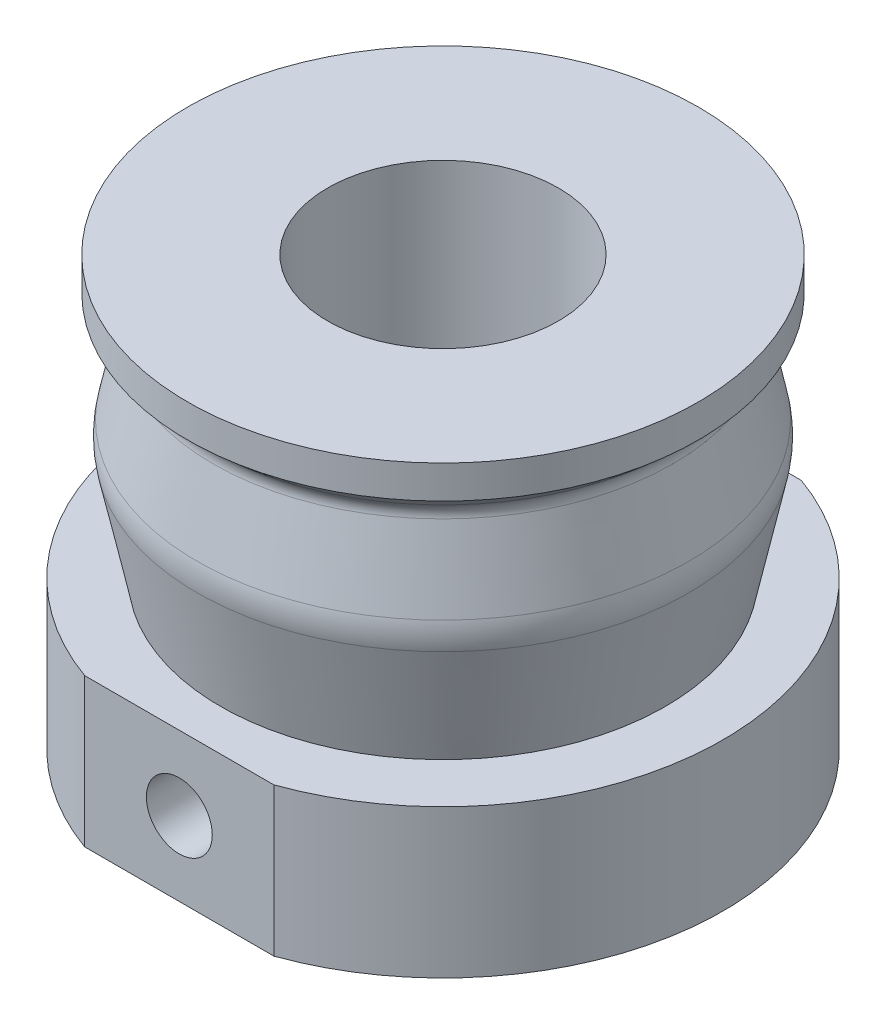
ISO-10303-21;
HEADER;
FILE_DESCRIPTION(('STEP AP214'),'2;1');
FILE_NAME('part.step','',(''),(''),'','','');
FILE_SCHEMA(('AUTOMOTIVE_DESIGN { 1 0 10303 214 1 1 1 1 }'));
ENDSEC;
DATA;
#1=APPLICATION_CONTEXT('core data for automotive mechanical design processes');
#2=APPLICATION_PROTOCOL_DEFINITION('international standard','automotive_design',2000,#1);
#3=PRODUCT_CONTEXT('',#1,'mechanical');
#4=PRODUCT('Part','Part','',(#3));
#5=PRODUCT_RELATED_PRODUCT_CATEGORY('part','',(#4));
#6=PRODUCT_DEFINITION_FORMATION('','',#4);
#7=PRODUCT_DEFINITION_CONTEXT('part definition',#1,'design');
#8=PRODUCT_DEFINITION('design','',#6,#7);
#9=PRODUCT_DEFINITION_SHAPE('','',#8);
#10=(LENGTH_UNIT() NAMED_UNIT(*) SI_UNIT(.MILLI.,.METRE.));
#11=(NAMED_UNIT(*) PLANE_ANGLE_UNIT() SI_UNIT($,.RADIAN.));
#12=(NAMED_UNIT(*) SI_UNIT($,.STERADIAN.) SOLID_ANGLE_UNIT());
#13=UNCERTAINTY_MEASURE_WITH_UNIT(LENGTH_MEASURE(1.E-05),#10,'distance_accuracy_value','');
#14=(GEOMETRIC_REPRESENTATION_CONTEXT(3) GLOBAL_UNCERTAINTY_ASSIGNED_CONTEXT((#13)) GLOBAL_UNIT_ASSIGNED_CONTEXT((#10,
#11,#12)) REPRESENTATION_CONTEXT('',''));
#15=CARTESIAN_POINT('',(0.,0.,0.));
#16=DIRECTION('',(0.,0.,1.));
#17=DIRECTION('',(1.,0.,0.));
#18=AXIS2_PLACEMENT_3D('',#15,#16,#17);
#19=CARTESIAN_POINT('',(8.5,0.,0.));
#20=DIRECTION('',(0.,-1.,0.));
#21=DIRECTION('',(0.,0.,-1.));
#22=AXIS2_PLACEMENT_3D('',#19,#20,#21);
#23=PLANE('',#22);
#24=CARTESIAN_POINT('',(0.,0.,0.));
#25=DIRECTION('',(0.,-1.,0.));
#26=DIRECTION('',(0.,0.,-1.));
#27=AXIS2_PLACEMENT_3D('',#24,#25,#26);
#28=CIRCLE('',#27,3.5);
#29=CARTESIAN_POINT('',(0.,0.,-3.5));
#30=VERTEX_POINT('',#29);
#31=EDGE_CURVE('E116',#30,#30,#28,.T.);
#32=ORIENTED_EDGE('',*,*,#31,.F.);
#33=EDGE_LOOP('',(#32));
#34=FACE_BOUND('',#33,.T.);
#35=CARTESIAN_POINT('',(0.,0.,0.));
#36=DIRECTION('',(0.,-1.,0.));
#37=DIRECTION('',(0.,0.,-1.));
#38=AXIS2_PLACEMENT_3D('',#35,#36,#37);
#39=CIRCLE('',#38,8.5);
#40=CARTESIAN_POINT('',(-2.87228132326902,0.,8.));
#41=VERTEX_POINT('',#40);
#42=CARTESIAN_POINT('',(-2.87228132326902,0.,-8.));
#43=VERTEX_POINT('',#42);
#44=EDGE_CURVE('E98',#41,#43,#39,.T.);
#45=ORIENTED_EDGE('',*,*,#44,.T.);
#46=DIRECTION('',(1.,0.,0.));
#47=VECTOR('',#46,1.);
#48=CARTESIAN_POINT('',(-2.87228132326902,0.,-8.));
#49=LINE('',#48,#47);
#50=CARTESIAN_POINT('',(2.87228132326902,0.,-8.));
#51=VERTEX_POINT('',#50);
#52=EDGE_CURVE('E48',#43,#51,#49,.T.);
#53=ORIENTED_EDGE('',*,*,#52,.T.);
#54=CARTESIAN_POINT('',(2.87228132326902,0.,8.));
#55=VERTEX_POINT('',#54);
#56=EDGE_CURVE('E308',#51,#55,#39,.T.);
#57=ORIENTED_EDGE('',*,*,#56,.T.);
#58=DIRECTION('',(1.,0.,0.));
#59=VECTOR('',#58,1.);
#60=CARTESIAN_POINT('',(-2.87228132326902,0.,8.));
#61=LINE('',#60,#59);
#62=EDGE_CURVE('E314',#41,#55,#61,.T.);
#63=ORIENTED_EDGE('',*,*,#62,.F.);
#64=EDGE_LOOP('',(#45,#53,#57,#63));
#65=FACE_BOUND('',#64,.T.);
#66=ADVANCED_FACE('F33',(#34,#65),#23,.T.);
#67=CARTESIAN_POINT('',(6.75,4.5,0.));
#68=DIRECTION('',(0.,1.,0.));
#69=DIRECTION('',(0.,0.,1.));
#70=AXIS2_PLACEMENT_3D('',#67,#68,#69);
#71=PLANE('',#70);
#72=CARTESIAN_POINT('',(0.,4.5,0.));
#73=DIRECTION('',(0.,-1.,0.));
#74=DIRECTION('',(0.,0.,-1.));
#75=AXIS2_PLACEMENT_3D('',#72,#73,#74);
#76=CIRCLE('',#75,6.75);
#77=CARTESIAN_POINT('',(0.,4.5,-6.75));
#78=VERTEX_POINT('',#77);
#79=EDGE_CURVE('E93',#78,#78,#76,.T.);
#80=ORIENTED_EDGE('',*,*,#79,.T.);
#81=EDGE_LOOP('',(#80));
#82=FACE_BOUND('',#81,.T.);
#83=CARTESIAN_POINT('',(0.,4.5,0.));
#84=DIRECTION('',(0.,-1.,0.));
#85=DIRECTION('',(0.,0.,-1.));
#86=AXIS2_PLACEMENT_3D('',#83,#84,#85);
#87=CIRCLE('',#86,8.5);
#88=CARTESIAN_POINT('',(2.87228132326902,4.5,-8.));
#89=VERTEX_POINT('',#88);
#90=CARTESIAN_POINT('',(2.87228132326902,4.5,8.));
#91=VERTEX_POINT('',#90);
#92=EDGE_CURVE('E88',#89,#91,#87,.T.);
#93=ORIENTED_EDGE('',*,*,#92,.F.);
#94=DIRECTION('',(1.,0.,0.));
#95=VECTOR('',#94,1.);
#96=CARTESIAN_POINT('',(-2.87228132326902,4.5,-8.));
#97=LINE('',#96,#95);
#98=CARTESIAN_POINT('',(-2.87228132326902,4.5,-8.));
#99=VERTEX_POINT('',#98);
#100=EDGE_CURVE('E75',#99,#89,#97,.T.);
#101=ORIENTED_EDGE('',*,*,#100,.F.);
#102=CARTESIAN_POINT('',(-2.87228132326902,4.5,7.99999999999999));
#103=VERTEX_POINT('',#102);
#104=EDGE_CURVE('E87',#103,#99,#87,.T.);
#105=ORIENTED_EDGE('',*,*,#104,.F.);
#106=DIRECTION('',(1.,0.,0.));
#107=VECTOR('',#106,1.);
#108=CARTESIAN_POINT('',(-2.87228132326902,4.5,8.));
#109=LINE('',#108,#107);
#110=EDGE_CURVE('E56',#103,#91,#109,.T.);
#111=ORIENTED_EDGE('',*,*,#110,.T.);
#112=EDGE_LOOP('',(#93,#101,#105,#111));
#113=FACE_BOUND('',#112,.T.);
#114=ADVANCED_FACE('F86',(#82,#113),#71,.T.);
#115=CARTESIAN_POINT('',(0.,0.,0.));
#116=DIRECTION('',(0.,-1.,0.));
#117=DIRECTION('',(0.,0.,-1.));
#118=AXIS2_PLACEMENT_3D('',#115,#116,#117);
#119=CYLINDRICAL_SURFACE('',#118,8.5);
#120=ORIENTED_EDGE('',*,*,#56,.F.);
#121=DIRECTION('',(0.,-1.,0.));
#122=VECTOR('',#121,1.);
#123=CARTESIAN_POINT('',(2.87228132326902,10.2662812973354,-8.));
#124=LINE('',#123,#122);
#125=EDGE_CURVE('E81',#89,#51,#124,.T.);
#126=ORIENTED_EDGE('',*,*,#125,.F.);
#127=ORIENTED_EDGE('',*,*,#92,.T.);
#128=DIRECTION('',(0.,-1.,0.));
#129=VECTOR('',#128,1.);
#130=CARTESIAN_POINT('',(2.87228132326902,10.2662812973354,8.));
#131=LINE('',#130,#129);
#132=EDGE_CURVE('E309',#91,#55,#131,.T.);
#133=ORIENTED_EDGE('',*,*,#132,.T.);
#134=EDGE_LOOP('',(#120,#126,#127,#133));
#135=FACE_BOUND('',#134,.T.);
#136=ADVANCED_FACE('F139',(#135),#119,.T.);
#137=ORIENTED_EDGE('',*,*,#104,.T.);
#138=DIRECTION('',(0.,-1.,0.));
#139=VECTOR('',#138,1.);
#140=CARTESIAN_POINT('',(-2.87228132326902,10.2662812973354,-8.));
#141=LINE('',#140,#139);
#142=EDGE_CURVE('E72',#99,#43,#141,.T.);
#143=ORIENTED_EDGE('',*,*,#142,.T.);
#144=ORIENTED_EDGE('',*,*,#44,.F.);
#145=DIRECTION('',(0.,-1.,0.));
#146=VECTOR('',#145,1.);
#147=CARTESIAN_POINT('',(-2.87228132326902,10.2662812973354,8.));
#148=LINE('',#147,#146);
#149=EDGE_CURVE('E92',#103,#41,#148,.T.);
#150=ORIENTED_EDGE('',*,*,#149,.F.);
#151=EDGE_LOOP('',(#137,#143,#144,#150));
#152=FACE_BOUND('',#151,.T.);
#153=ADVANCED_FACE('F91',(#152),#119,.T.);
#154=CARTESIAN_POINT('',(0.,0.,0.));
#155=DIRECTION('',(0.,-1.,0.));
#156=DIRECTION('',(0.,0.,-1.));
#157=AXIS2_PLACEMENT_3D('',#154,#155,#156);
#158=CYLINDRICAL_SURFACE('',#157,3.5);
#159=CARTESIAN_POINT('',(0.,3.25,-3.5));
#160=CARTESIAN_POINT('',(-0.0549774511886256,3.24999903021902,-3.49999934647171));
#161=CARTESIAN_POINT('',(-0.109964873936291,3.24545110551194,-3.49869208701023));
#162=CARTESIAN_POINT('',(-0.218345995598494,3.22741786494884,-3.4936045297255));
#163=CARTESIAN_POINT('',(-0.271739083414807,3.21392916696296,-3.48982329605034));
#164=CARTESIAN_POINT('',(-0.375352150368935,3.17849598079174,-3.48020345674544));
#165=CARTESIAN_POINT('',(-0.425576440424113,3.15656328192402,-3.474367720532));
#166=CARTESIAN_POINT('',(-0.521634380564634,3.10491100426083,-3.46124989158242));
#167=CARTESIAN_POINT('',(-0.567467570589076,3.07519061075486,-3.45396764753901));
#168=CARTESIAN_POINT('',(-0.654647223429477,3.0079824946635,-3.43852367312903));
#169=CARTESIAN_POINT('',(-0.695861861190489,2.97032762307222,-3.4303452097302));
#170=CARTESIAN_POINT('',(-0.771485678962154,2.88867612843131,-3.41413367457396));
#171=CARTESIAN_POINT('',(-0.805893838538837,2.84467855618443,-3.40610062478085));
#172=CARTESIAN_POINT('',(-0.867598950032227,2.75050320860399,-3.39091507439313));
#173=CARTESIAN_POINT('',(-0.894739105517027,2.70021900746547,-3.38378351259108));
#174=CARTESIAN_POINT('',(-0.940125852769614,2.59556399412672,-3.37145671914235));
#175=CARTESIAN_POINT('',(-0.958374357777523,2.5411940639724,-3.36626107099664));
#176=CARTESIAN_POINT('',(-0.984992165068875,2.43138261841595,-3.35856804120241));
#177=CARTESIAN_POINT('',(-0.993602766016074,2.37600431860089,-3.35600489366891));
#178=CARTESIAN_POINT('',(-1.00145333894795,2.26453442575838,-3.35367104182518));
#179=CARTESIAN_POINT('',(-1.00069534704803,2.20844299036685,-3.35389973075333));
#180=CARTESIAN_POINT('',(-0.990020673813952,2.0990656942732,-3.35706517184156));
#181=CARTESIAN_POINT('',(-0.980401628641804,2.04574782440997,-3.35991391343389));
#182=CARTESIAN_POINT('',(-0.952756930429097,1.94151639018586,-3.36785674196985));
#183=CARTESIAN_POINT('',(-0.934730517406289,1.89060304363966,-3.37295103189706));
#184=CARTESIAN_POINT('',(-0.890553405689019,1.79187687778419,-3.38488431756517));
#185=CARTESIAN_POINT('',(-0.864302755864396,1.74411146379919,-3.39174458202416));
#186=CARTESIAN_POINT('',(-0.804491895839435,1.65356171939327,-3.40642608441438));
#187=CARTESIAN_POINT('',(-0.770930058366727,1.61077850113254,-3.41424753611068));
#188=CARTESIAN_POINT('',(-0.695951998365102,1.52971381219683,-3.43033125328062));
#189=CARTESIAN_POINT('',(-0.654287437422664,1.49166276201639,-3.43859902286152));
#190=CARTESIAN_POINT('',(-0.565066141193114,1.42303699817986,-3.45438123609203));
#191=CARTESIAN_POINT('',(-0.517509100740947,1.39246267197915,-3.46189564068921));
#192=CARTESIAN_POINT('',(-0.417461536545723,1.33953563261298,-3.47538264032742));
#193=CARTESIAN_POINT('',(-0.364944908905003,1.31722985659791,-3.48134637748612));
#194=CARTESIAN_POINT('',(-0.256696614983736,1.28183305429159,-3.49099625743795));
#195=CARTESIAN_POINT('',(-0.200965762905074,1.26873970537736,-3.49468297428128));
#196=CARTESIAN_POINT('',(-0.0898331943221761,1.25251335714527,-3.49927437257336));
#197=CARTESIAN_POINT('',(-0.0344806734302551,1.24906765231349,-3.50026636425301));
#198=CARTESIAN_POINT('',(0.0760132634027893,1.25136363315052,-3.49961042353544));
#199=CARTESIAN_POINT('',(0.131154703878551,1.25710421642296,-3.49796280790309));
#200=CARTESIAN_POINT('',(0.238509316715157,1.27735522215813,-3.49226963342609));
#201=CARTESIAN_POINT('',(0.290759105867425,1.29168659066171,-3.48827306508862));
#202=CARTESIAN_POINT('',(0.392104343102813,1.32850025099232,-3.4783399937092));
#203=CARTESIAN_POINT('',(0.441199425624335,1.35098348544461,-3.47240326632854));
#204=CARTESIAN_POINT('',(0.536020842560035,1.40401166832262,-3.45904980584657));
#205=CARTESIAN_POINT('',(0.581651243270125,1.43472059941289,-3.45160381589488));
#206=CARTESIAN_POINT('',(0.667219264029652,1.50312625297532,-3.43608973548903));
#207=CARTESIAN_POINT('',(0.707155585421212,1.54082456503143,-3.42802150376367));
#208=CARTESIAN_POINT('',(0.781553214170351,1.6236046710256,-3.41184309815947));
#209=CARTESIAN_POINT('',(0.815792713704768,1.66888763778285,-3.40374018433795));
#210=CARTESIAN_POINT('',(0.876197658032578,1.76473129430901,-3.38869447362751));
#211=CARTESIAN_POINT('',(0.902363383738852,1.81529180037321,-3.3817516363796));
#212=CARTESIAN_POINT('',(0.945687270594169,1.92004560549588,-3.36989325638715));
#213=CARTESIAN_POINT('',(0.962893166212214,1.97421788178634,-3.36496700079018));
#214=CARTESIAN_POINT('',(0.987897250353702,2.08485496782719,-3.35771228398834));
#215=CARTESIAN_POINT('',(0.995698289511609,2.141319077551,-3.35538303564047));
#216=CARTESIAN_POINT('',(1.00149012123096,2.25264801646077,-3.35365851547575));
#217=CARTESIAN_POINT('',(0.99984013822114,2.30749275227629,-3.35415580399703));
#218=CARTESIAN_POINT('',(0.987623554788213,2.41608736533289,-3.35777298607399));
#219=CARTESIAN_POINT('',(0.9770572518996,2.4698372790465,-3.36089279211717));
#220=CARTESIAN_POINT('',(0.947529844083141,2.57418918558376,-3.36933488579116));
#221=CARTESIAN_POINT('',(0.928655458931762,2.62481769350544,-3.37463438524179));
#222=CARTESIAN_POINT('',(0.883114746507967,2.72222936724624,-3.38683651421364));
#223=CARTESIAN_POINT('',(0.856447040215776,2.76901185063665,-3.3937394274128));
#224=CARTESIAN_POINT('',(0.795032732674123,2.85909176090262,-3.40865834474881));
#225=CARTESIAN_POINT('',(0.760046138613654,2.90222069567097,-3.41670381589509));
#226=CARTESIAN_POINT('',(0.683429920189677,2.98211194790492,-3.43284922546139));
#227=CARTESIAN_POINT('',(0.641798625364279,3.0188726595554,-3.4409491770859));
#228=CARTESIAN_POINT('',(0.551787160432694,3.08591859216331,-3.45653979786176));
#229=CARTESIAN_POINT('',(0.503261251179889,3.11601349363481,-3.46400950518705));
#230=CARTESIAN_POINT('',(0.40162526482333,3.167572892511,-3.47725697888987));
#231=CARTESIAN_POINT('',(0.348517712057369,3.18904210596653,-3.48303566935144));
#232=CARTESIAN_POINT('',(0.246458157667516,3.22042377569772,-3.49163672362654));
#233=CARTESIAN_POINT('',(0.197881503812194,3.23148676834228,-3.49474842181038));
#234=CARTESIAN_POINT('',(0.0995391843931832,3.24627482862107,-3.49893021926074));
#235=CARTESIAN_POINT('',(0.0497736788080457,3.25000087798844,-3.50000059166998));
#236=CARTESIAN_POINT('',(0.,3.25,-3.5));
#237=B_SPLINE_CURVE_WITH_KNOTS('',3,(#159,#160,#161,#162,#163,#164,#165,#166,#167,#168,#169,
#170,#171,#172,#173,#174,#175,#176,#177,#178,#179,#180,#181,#182,#183,#184,#185,#186,#187,#188,
#189,#190,#191,#192,#193,#194,#195,#196,#197,#198,#199,#200,#201,#202,#203,#204,#205,#206,#207,
#208,#209,#210,#211,#212,#213,#214,#215,#216,#217,#218,#219,#220,#221,#222,#223,#224,#225,#226,
#227,#228,#229,#230,#231,#232,#233,#234,#235,#236),.UNSPECIFIED.,.T.,.F.,(4,2,2,2,2,2,2,2,2,2,2,
2,2,2,2,2,2,2,2,2,2,2,2,2,2,2,2,2,2,2,2,2,2,2,2,2,2,2,4),(0.,0.164749656271172,
0.329561669897589,0.494144406447671,0.658744367717578,0.827239057653905,0.995758989368565,
1.16766537650028,1.33953475772405,1.50699754929408,1.67442394611627,1.83642392910677,
1.99843855889074,2.16250401641616,2.32660602784682,2.49689250297262,2.66718780073735,
2.83843550548235,3.00964002003317,3.17522728845111,3.34079468713335,3.5030257023577,
3.66527548283775,3.83103762668236,3.99683751589904,4.16806052438178,4.3392775747866,
4.50957286677748,4.6798165288708,4.84363340801449,5.00744482086202,5.16958548138844,
5.33175484992001,5.49933828438394,5.66696391547448,5.83888989478294,6.01072174610256,
6.15989734012185,6.30905297207071),.UNSPECIFIED.);
#238=CARTESIAN_POINT('',(0.,3.25,-3.5));
#239=VERTEX_POINT('',#238);
#240=EDGE_CURVE('E161',#239,#239,#237,.T.);
#241=ORIENTED_EDGE('',*,*,#240,.F.);
#242=EDGE_LOOP('',(#241));
#243=FACE_BOUND('',#242,.T.);
#244=CARTESIAN_POINT('',(0.999999999999998,2.25,3.35410196624969));
#245=CARTESIAN_POINT('',(0.999999010234616,2.19507423107725,3.3541027352982));
#246=CARTESIAN_POINT('',(0.995459333009391,2.14013845792023,3.35546589937234));
#247=CARTESIAN_POINT('',(0.977461816962146,2.03186438061244,3.36075194701915));
#248=CARTESIAN_POINT('',(0.964000350683297,1.97852673545843,3.36467587174621));
#249=CARTESIAN_POINT('',(0.928646716460407,1.8750313995488,3.37460354734502));
#250=CARTESIAN_POINT('',(0.906767603258317,1.82486892408729,3.38060407621639));
#251=CARTESIAN_POINT('',(0.855241820315738,1.72891609422696,3.3940046055512));
#252=CARTESIAN_POINT('',(0.825594228332017,1.68312625981211,3.40140477214508));
#253=CARTESIAN_POINT('',(0.7584624004907,1.59590421734143,3.41700891605117));
#254=CARTESIAN_POINT('',(0.720794605566167,1.55461609893508,3.42522877981549));
#255=CARTESIAN_POINT('',(0.639085622734712,1.47884860834841,3.44140982756535));
#256=CARTESIAN_POINT('',(0.595043689579836,1.44437003343866,3.44937098116968));
#257=CARTESIAN_POINT('',(0.500823016078772,1.38258567582316,3.46431666000612));
#258=CARTESIAN_POINT('',(0.450545391880927,1.35542519012449,3.47128027250395));
#259=CARTESIAN_POINT('',(0.345904237619825,1.30999911279204,3.48326270242804));
#260=CARTESIAN_POINT('',(0.291541505437587,1.29173178937987,3.48828189845443));
#261=CARTESIAN_POINT('',(0.181779287560587,1.26508276938014,3.49569759650108));
#262=CARTESIAN_POINT('',(0.126443899064519,1.25645548914766,3.49815913505649));
#263=CARTESIAN_POINT('',(0.0150600512109618,1.24855663305838,3.50041047829849));
#264=CARTESIAN_POINT('',(-0.0409882697942744,1.24928326883132,3.50020079369491));
#265=CARTESIAN_POINT('',(-0.150490097867611,1.25990318745901,3.49718003381653));
#266=CARTESIAN_POINT('',(-0.203971773054473,1.26953080631899,3.49444435388027));
#267=CARTESIAN_POINT('',(-0.308526111088809,1.29724755123219,3.48676943165067));
#268=CARTESIAN_POINT('',(-0.359598627150254,1.31533719213106,3.48183005528105));
#269=CARTESIAN_POINT('',(-0.458536916864462,1.35965470040591,3.47019515886062));
#270=CARTESIAN_POINT('',(-0.506361521925386,1.38596938890417,3.46348102756093));
#271=CARTESIAN_POINT('',(-0.597003621795241,1.44592229319901,3.44901384486994));
#272=CARTESIAN_POINT('',(-0.639820016208003,1.47956211383323,3.44126056595877));
#273=CARTESIAN_POINT('',(-0.720816324273876,1.5546028553093,3.42522841509913));
#274=CARTESIAN_POINT('',(-0.758780788792452,1.59623471680255,3.41694064685079));
#275=CARTESIAN_POINT('',(-0.827246507874876,1.68535754592295,3.4010148689311));
#276=CARTESIAN_POINT('',(-0.857747156891286,1.73284898847439,3.39337691201241));
#277=CARTESIAN_POINT('',(-0.910616679927254,1.83286544224911,3.37957587408658));
#278=CARTESIAN_POINT('',(-0.932918688943924,1.88542761252626,3.37342505474766));
#279=CARTESIAN_POINT('',(-0.96829475748038,1.99377658175188,3.36344272188227));
#280=CARTESIAN_POINT('',(-0.981371502013289,2.04956243732834,3.35961053356453));
#281=CARTESIAN_POINT('',(-0.997537085998826,2.16074021216189,3.35484557617748));
#282=CARTESIAN_POINT('',(-1.00095074078696,2.21608090846044,3.35381855730448));
#283=CARTESIAN_POINT('',(-0.998594983598454,2.32654415795746,3.35452079870229));
#284=CARTESIAN_POINT('',(-0.992826717122484,2.38166673750731,3.35624971515342));
#285=CARTESIAN_POINT('',(-0.972558907129288,2.48882061401528,3.36217715008271));
#286=CARTESIAN_POINT('',(-0.958262310920607,2.5408937930086,3.3663182147774));
#287=CARTESIAN_POINT('',(-0.92157580933224,2.64190093599785,3.37654531970352));
#288=CARTESIAN_POINT('',(-0.899184736133866,2.69083444582255,3.38263164056921));
#289=CARTESIAN_POINT('',(-0.846309825608091,2.78551103760866,3.3962509400331));
#290=CARTESIAN_POINT('',(-0.815639458645649,2.83114522210117,3.4038159869019));
#291=CARTESIAN_POINT('',(-0.747302318424214,2.9167381867216,3.41946863275287));
#292=CARTESIAN_POINT('',(-0.709634028840686,2.95669573350605,3.42755634473907));
#293=CARTESIAN_POINT('',(-0.626854004982777,3.03118970914411,3.44367363717939));
#294=CARTESIAN_POINT('',(-0.581533855120274,3.06549748570937,3.45169203023043));
#295=CARTESIAN_POINT('',(-0.485592653528773,3.12602284069136,3.46648988523027));
#296=CARTESIAN_POINT('',(-0.434971879049092,3.15224084196119,3.47326941192714));
#297=CARTESIAN_POINT('',(-0.330216636478083,3.19559214351316,3.48478252423195));
#298=CARTESIAN_POINT('',(-0.276112399949818,3.21279419479308,3.48953154063622));
#299=CARTESIAN_POINT('',(-0.165622824274962,3.23781340097009,3.49651669811944));
#300=CARTESIAN_POINT('',(-0.109238075792719,3.24563297009066,3.4987534856151));
#301=CARTESIAN_POINT('',(0.00208911897951403,3.25149571699889,3.50042667501642));
#302=CARTESIAN_POINT('',(0.0570128155249777,3.24987207454141,3.49995851794498));
#303=CARTESIAN_POINT('',(0.165772586211001,3.23768085929485,3.49649534561067));
#304=CARTESIAN_POINT('',(0.219608712308764,3.22711371480898,3.49350045135296));
#305=CARTESIAN_POINT('',(0.324202066519792,3.19753431951057,3.48534400930059));
#306=CARTESIAN_POINT('',(0.374982516717523,3.17859841052801,3.4802020702409));
#307=CARTESIAN_POINT('',(0.472673601380729,3.13288692085726,3.46828547071724));
#308=CARTESIAN_POINT('',(0.519583635290338,3.10611012645387,3.46151055750883));
#309=CARTESIAN_POINT('',(0.609716728176954,3.04455133128759,3.44679477720104));
#310=CARTESIAN_POINT('',(0.652788664003537,3.00955495660581,3.43882522893152));
#311=CARTESIAN_POINT('',(0.732560611159187,2.93294543727302,3.42272032493228));
#312=CARTESIAN_POINT('',(0.769258856094886,2.89133046445754,3.4145849239342));
#313=CARTESIAN_POINT('',(0.836204230145641,2.80135154150232,3.39882018772077));
#314=CARTESIAN_POINT('',(0.866256583618023,2.75283902624844,3.39120975884781));
#315=CARTESIAN_POINT('',(0.917739718098037,2.65123906734251,3.37764222665284));
#316=CARTESIAN_POINT('',(0.939175324424087,2.59815420445517,3.37168419857914));
#317=CARTESIAN_POINT('',(0.970492670062519,2.49617314988425,3.36279229780034));
#318=CARTESIAN_POINT('',(0.981529499909263,2.44765482595075,3.3595621942308));
#319=CARTESIAN_POINT('',(0.996283035217827,2.34942694082203,3.35521684727178));
#320=CARTESIAN_POINT('',(1.00000089591333,2.29971756887699,3.35410127012429));
#321=CARTESIAN_POINT('',(0.999999999999998,2.25,3.35410196624969));
#322=B_SPLINE_CURVE_WITH_KNOTS('',3,(#244,#245,#246,#247,#248,#249,#250,#251,#252,#253,#254,
#255,#256,#257,#258,#259,#260,#261,#262,#263,#264,#265,#266,#267,#268,#269,#270,#271,#272,#273,
#274,#275,#276,#277,#278,#279,#280,#281,#282,#283,#284,#285,#286,#287,#288,#289,#290,#291,#292,
#293,#294,#295,#296,#297,#298,#299,#300,#301,#302,#303,#304,#305,#306,#307,#308,#309,#310,#311,
#312,#313,#314,#315,#316,#317,#318,#319,#320,#321),.UNSPECIFIED.,.T.,.F.,(4,2,2,2,2,2,2,2,2,2,2,
2,2,2,2,2,2,2,2,2,2,2,2,2,2,2,2,2,2,2,2,2,2,2,2,2,2,2,4),(0.,0.164594171159104,0.32925530476515,
0.493662091823937,0.658088405459392,0.826785835988799,0.995503006148132,1.16735741502495,
1.33917834504425,1.50651450509943,1.67381867271781,1.83628518817282,1.99876158968832,
2.16301451684817,2.32730346587989,2.49735806342072,2.66742645310451,2.83885260310574,
3.01022883892077,3.17577181660545,3.34129414341278,3.50302644820309,3.66478209600073,
3.83054003013244,3.99633392302105,4.16772694180381,4.33911100034377,4.50916842641097,
4.67918208530372,4.84323448834083,5.0072790353734,5.16985706186658,5.33246026763664,
5.49989884364739,5.6673837494971,5.83926806202706,6.01105598599878,6.16006644425299,
6.30905338065553),.UNSPECIFIED.);
#323=CARTESIAN_POINT('',(0.999999999999998,2.25,3.35410196624969));
#324=VERTEX_POINT('',#323);
#325=EDGE_CURVE('E154',#324,#324,#322,.T.);
#326=ORIENTED_EDGE('',*,*,#325,.F.);
#327=EDGE_LOOP('',(#326));
#328=FACE_BOUND('',#327,.T.);
#329=ORIENTED_EDGE('',*,*,#31,.T.);
#330=EDGE_LOOP('',(#329));
#331=FACE_BOUND('',#330,.T.);
#332=CARTESIAN_POINT('',(0.,13.,0.));
#333=DIRECTION('',(0.,-1.,0.));
#334=DIRECTION('',(0.,0.,-1.));
#335=AXIS2_PLACEMENT_3D('',#332,#333,#334);
#336=CIRCLE('',#335,3.5);
#337=CARTESIAN_POINT('',(0.,13.,-3.5));
#338=VERTEX_POINT('',#337);
#339=EDGE_CURVE('E113',#338,#338,#336,.T.);
#340=ORIENTED_EDGE('',*,*,#339,.F.);
#341=EDGE_LOOP('',(#340));
#342=FACE_BOUND('',#341,.T.);
#343=ADVANCED_FACE('F145',(#243,#328,#331,#342),#158,.F.);
#344=CARTESIAN_POINT('',(3.5,13.,0.));
#345=DIRECTION('',(0.,1.,0.));
#346=DIRECTION('',(0.,0.,1.));
#347=AXIS2_PLACEMENT_3D('',#344,#345,#346);
#348=PLANE('',#347);
#349=ORIENTED_EDGE('',*,*,#339,.T.);
#350=EDGE_LOOP('',(#349));
#351=FACE_BOUND('',#350,.T.);
#352=CARTESIAN_POINT('',(0.,13.,0.));
#353=DIRECTION('',(0.,-1.,0.));
#354=DIRECTION('',(0.,0.,-1.));
#355=AXIS2_PLACEMENT_3D('',#352,#353,#354);
#356=CIRCLE('',#355,7.75);
#357=CARTESIAN_POINT('',(0.,13.,-7.75));
#358=VERTEX_POINT('',#357);
#359=EDGE_CURVE('E110',#358,#358,#356,.T.);
#360=ORIENTED_EDGE('',*,*,#359,.F.);
#361=EDGE_LOOP('',(#360));
#362=FACE_BOUND('',#361,.T.);
#363=ADVANCED_FACE('F149',(#351,#362),#348,.T.);
#364=CARTESIAN_POINT('',(0.,0.,0.));
#365=DIRECTION('',(0.,-1.,0.));
#366=DIRECTION('',(0.,0.,-1.));
#367=AXIS2_PLACEMENT_3D('',#364,#365,#366);
#368=CYLINDRICAL_SURFACE('',#367,7.75);
#369=ORIENTED_EDGE('',*,*,#359,.T.);
#370=EDGE_LOOP('',(#369));
#371=FACE_BOUND('',#370,.T.);
#372=CARTESIAN_POINT('',(0.,12.,0.));
#373=DIRECTION('',(0.,-1.,0.));
#374=DIRECTION('',(0.,0.,-1.));
#375=AXIS2_PLACEMENT_3D('',#372,#373,#374);
#376=CIRCLE('',#375,7.75);
#377=CARTESIAN_POINT('',(0.,12.,-7.75));
#378=VERTEX_POINT('',#377);
#379=EDGE_CURVE('E107',#378,#378,#376,.T.);
#380=ORIENTED_EDGE('',*,*,#379,.F.);
#381=EDGE_LOOP('',(#380));
#382=FACE_BOUND('',#381,.T.);
#383=ADVANCED_FACE('F196',(#371,#382),#368,.T.);
#384=CARTESIAN_POINT('',(0.,8.66447273212057,0.));
#385=DIRECTION('',(0.,-1.,0.));
#386=DIRECTION('',(0.,0.,-1.));
#387=AXIS2_PLACEMENT_3D('',#384,#385,#386);
#388=CONICAL_SURFACE('',#387,7.4565818036383,0.20874914892229);
#389=CARTESIAN_POINT('',(0.,10.9782788332256,0.));
#390=DIRECTION('',(0.,1.,0.));
#391=DIRECTION('',(0.,0.,1.));
#392=AXIS2_PLACEMENT_3D('',#389,#390,#391);
#393=CIRCLE('',#392,6.96643642124797);
#394=CARTESIAN_POINT('',(0.,10.9782788332256,6.96643642124797));
#395=VERTEX_POINT('',#394);
#396=EDGE_CURVE('E41',#395,#395,#393,.F.);
#397=ORIENTED_EDGE('',*,*,#396,.T.);
#398=EDGE_LOOP('',(#397));
#399=FACE_BOUND('',#398,.T.);
#400=CARTESIAN_POINT('',(0.,8.66447273212057,0.));
#401=DIRECTION('',(0.,-1.,0.));
#402=DIRECTION('',(0.,0.,-1.));
#403=AXIS2_PLACEMENT_3D('',#400,#401,#402);
#404=CIRCLE('',#403,7.4565818036383);
#405=CARTESIAN_POINT('',(0.,8.66447273212057,-7.4565818036383));
#406=VERTEX_POINT('',#405);
#407=EDGE_CURVE('E104',#406,#406,#404,.T.);
#408=ORIENTED_EDGE('',*,*,#407,.F.);
#409=EDGE_LOOP('',(#408));
#410=FACE_BOUND('',#409,.T.);
#411=ADVANCED_FACE('F121',(#399,#410),#388,.T.);
#412=CARTESIAN_POINT('',(0.,8.25,0.));
#413=DIRECTION('',(0.,-1.,0.));
#414=DIRECTION('',(0.,0.,-1.));
#415=AXIS2_PLACEMENT_3D('',#412,#413,#414);
#416=TOROIDAL_SURFACE('',#415,5.5,2.);
#417=ORIENTED_EDGE('',*,*,#407,.T.);
#418=EDGE_LOOP('',(#417));
#419=FACE_BOUND('',#418,.T.);
#420=CARTESIAN_POINT('',(0.,7.83552726787944,0.));
#421=DIRECTION('',(0.,-1.,0.));
#422=DIRECTION('',(0.,0.,-1.));
#423=AXIS2_PLACEMENT_3D('',#420,#421,#422);
#424=CIRCLE('',#423,7.4565818036383);
#425=CARTESIAN_POINT('',(0.,7.83552726787944,-7.4565818036383));
#426=VERTEX_POINT('',#425);
#427=EDGE_CURVE('E96',#426,#426,#424,.T.);
#428=ORIENTED_EDGE('',*,*,#427,.F.);
#429=EDGE_LOOP('',(#428));
#430=FACE_BOUND('',#429,.T.);
#431=ADVANCED_FACE('F190',(#419,#430),#416,.T.);
#432=CARTESIAN_POINT('',(0.,4.5,0.));
#433=DIRECTION('',(0.,1.,0.));
#434=DIRECTION('',(0.,0.,1.));
#435=AXIS2_PLACEMENT_3D('',#432,#433,#434);
#436=CONICAL_SURFACE('',#435,6.75,0.208749148922289);
#437=ORIENTED_EDGE('',*,*,#427,.T.);
#438=EDGE_LOOP('',(#437));
#439=FACE_BOUND('',#438,.T.);
#440=ORIENTED_EDGE('',*,*,#79,.F.);
#441=EDGE_LOOP('',(#440));
#442=FACE_BOUND('',#441,.T.);
#443=ADVANCED_FACE('F183',(#439,#442),#436,.T.);
#444=CARTESIAN_POINT('',(-2.87228132326902,10.2662812973354,8.));
#445=DIRECTION('',(0.,0.,-1.));
#446=DIRECTION('',(-1.,0.,0.));
#447=AXIS2_PLACEMENT_3D('',#444,#445,#446);
#448=PLANE('',#447);
#449=CARTESIAN_POINT('',(0.,2.25,8.));
#450=DIRECTION('',(0.,0.,1.));
#451=DIRECTION('',(1.,0.,0.));
#452=AXIS2_PLACEMENT_3D('',#449,#450,#451);
#453=CIRCLE('',#452,0.999999999999999);
#454=CARTESIAN_POINT('',(0.999999999999998,2.25,8.));
#455=VERTEX_POINT('',#454);
#456=EDGE_CURVE('E89',#455,#455,#453,.T.);
#457=ORIENTED_EDGE('',*,*,#456,.F.);
#458=EDGE_LOOP('',(#457));
#459=FACE_BOUND('',#458,.T.);
#460=ORIENTED_EDGE('',*,*,#149,.T.);
#461=ORIENTED_EDGE('',*,*,#62,.T.);
#462=ORIENTED_EDGE('',*,*,#132,.F.);
#463=ORIENTED_EDGE('',*,*,#110,.F.);
#464=EDGE_LOOP('',(#460,#461,#462,#463));
#465=FACE_BOUND('',#464,.T.);
#466=ADVANCED_FACE('F179',(#459,#465),#448,.F.);
#467=CARTESIAN_POINT('',(0.,2.25,8.));
#468=DIRECTION('',(0.,0.,1.));
#469=DIRECTION('',(1.,0.,0.));
#470=AXIS2_PLACEMENT_3D('',#467,#468,#469);
#471=CYLINDRICAL_SURFACE('',#470,0.999999999999999);
#472=ORIENTED_EDGE('',*,*,#325,.T.);
#473=EDGE_LOOP('',(#472));
#474=FACE_BOUND('',#473,.T.);
#475=ORIENTED_EDGE('',*,*,#456,.T.);
#476=EDGE_LOOP('',(#475));
#477=FACE_BOUND('',#476,.T.);
#478=ADVANCED_FACE('F174',(#474,#477),#471,.F.);
#479=CARTESIAN_POINT('',(-2.87228132326902,10.2662812973354,-8.));
#480=DIRECTION('',(0.,0.,-1.));
#481=DIRECTION('',(-1.,0.,0.));
#482=AXIS2_PLACEMENT_3D('',#479,#480,#481);
#483=PLANE('',#482);
#484=CARTESIAN_POINT('',(0.,2.25,-8.));
#485=DIRECTION('',(0.,0.,-1.));
#486=DIRECTION('',(-1.,0.,0.));
#487=AXIS2_PLACEMENT_3D('',#484,#485,#486);
#488=CIRCLE('',#487,0.999999999999999);
#489=CARTESIAN_POINT('',(-1.,2.25,-8.));
#490=VERTEX_POINT('',#489);
#491=EDGE_CURVE('E168',#490,#490,#488,.T.);
#492=ORIENTED_EDGE('',*,*,#491,.F.);
#493=EDGE_LOOP('',(#492));
#494=FACE_BOUND('',#493,.T.);
#495=ORIENTED_EDGE('',*,*,#100,.T.);
#496=ORIENTED_EDGE('',*,*,#125,.T.);
#497=ORIENTED_EDGE('',*,*,#52,.F.);
#498=ORIENTED_EDGE('',*,*,#142,.F.);
#499=EDGE_LOOP('',(#495,#496,#497,#498));
#500=FACE_BOUND('',#499,.T.);
#501=ADVANCED_FACE('F74',(#494,#500),#483,.T.);
#502=CARTESIAN_POINT('',(0.,2.25,-8.));
#503=DIRECTION('',(0.,0.,-1.));
#504=DIRECTION('',(-1.,0.,0.));
#505=AXIS2_PLACEMENT_3D('',#502,#503,#504);
#506=CYLINDRICAL_SURFACE('',#505,0.999999999999999);
#507=ORIENTED_EDGE('',*,*,#240,.T.);
#508=EDGE_LOOP('',(#507));
#509=FACE_BOUND('',#508,.T.);
#510=ORIENTED_EDGE('',*,*,#491,.T.);
#511=EDGE_LOOP('',(#510));
#512=FACE_BOUND('',#511,.T.);
#513=ADVANCED_FACE('F130',(#509,#512),#506,.F.);
#514=CARTESIAN_POINT('',(0.,11.2662818236356,0.));
#515=DIRECTION('',(0.,1.,0.));
#516=DIRECTION('',(0.,0.,1.));
#517=AXIS2_PLACEMENT_3D('',#514,#515,#516);
#518=CONICAL_SURFACE('',#517,6.90542727454521,0.855520088102748);
#519=CARTESIAN_POINT('',(0.,11.459353069009,0.));
#520=DIRECTION('',(0.,-1.,0.));
#521=DIRECTION('',(0.,0.,-1.));
#522=AXIS2_PLACEMENT_3D('',#519,#520,#521);
#523=CIRCLE('',#522,7.12766888333279);
#524=CARTESIAN_POINT('',(0.,11.459353069009,-7.12766888333279));
#525=VERTEX_POINT('',#524);
#526=EDGE_CURVE('E11',#525,#525,#523,.F.);
#527=ORIENTED_EDGE('',*,*,#526,.T.);
#528=EDGE_LOOP('',(#527));
#529=FACE_BOUND('',#528,.T.);
#530=ORIENTED_EDGE('',*,*,#379,.T.);
#531=EDGE_LOOP('',(#530));
#532=FACE_BOUND('',#531,.T.);
#533=ADVANCED_FACE('F125',(#529,#532),#518,.T.);
#534=CARTESIAN_POINT('',(0.,11.0818970162558,0.));
#535=DIRECTION('',(0.,-1.,0.));
#536=DIRECTION('',(0.,0.,-1.));
#537=AXIS2_PLACEMENT_3D('',#534,#535,#536);
#538=TOROIDAL_SURFACE('',#537,7.45558187215755,0.5);
#539=ORIENTED_EDGE('',*,*,#526,.F.);
#540=EDGE_LOOP('',(#539));
#541=FACE_BOUND('',#540,.T.);
#542=ORIENTED_EDGE('',*,*,#396,.F.);
#543=EDGE_LOOP('',(#542));
#544=FACE_BOUND('',#543,.T.);
#545=ADVANCED_FACE('F35',(#541,#544),#538,.F.);
#546=CLOSED_SHELL('',(#66,#114,#136,#153,#343,#363,#383,#411,#431,#443,#466,#478,#501,#513,#533,#545));
#547=MANIFOLD_SOLID_BREP('B2',#546);
#548=ADVANCED_BREP_SHAPE_REPRESENTATION('',(#18,#547),#14);
#549=SHAPE_DEFINITION_REPRESENTATION(#9,#548);
ENDSEC;
END-ISO-10303-21;
